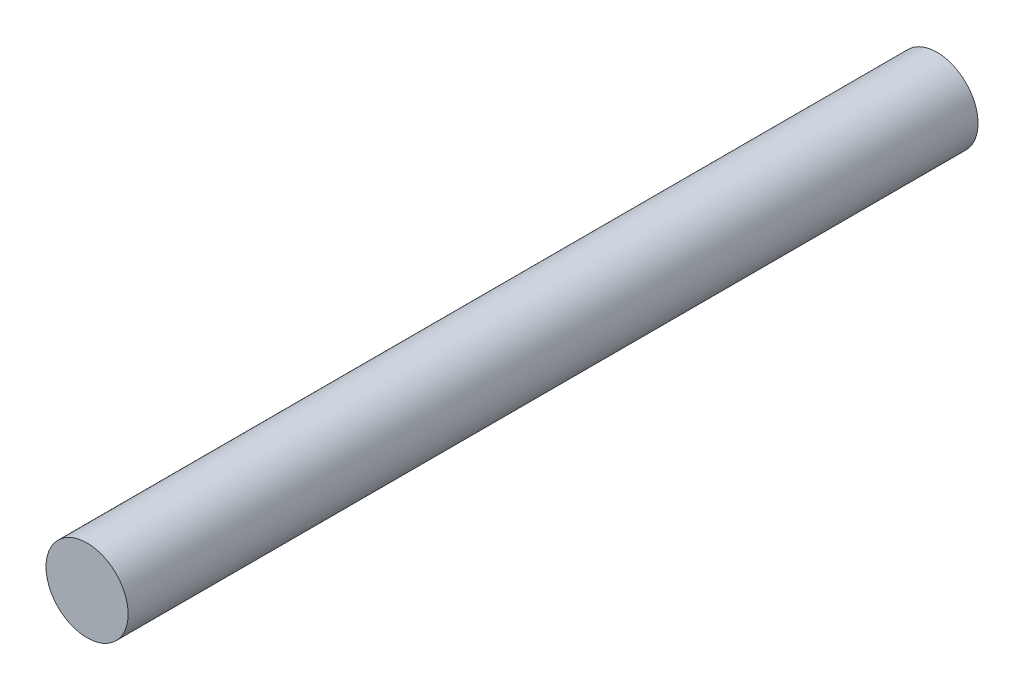
ISO-10303-21;
HEADER;
FILE_DESCRIPTION(('STEP AP214'),'2;1');
FILE_NAME('part.step','',(''),(''),'','','');
FILE_SCHEMA(('AUTOMOTIVE_DESIGN { 1 0 10303 214 1 1 1 1 }'));
ENDSEC;
DATA;
#1=APPLICATION_CONTEXT('core data for automotive mechanical design processes');
#2=APPLICATION_PROTOCOL_DEFINITION('international standard','automotive_design',2000,#1);
#3=PRODUCT_CONTEXT('',#1,'mechanical');
#4=PRODUCT('Part','Part','',(#3));
#5=PRODUCT_RELATED_PRODUCT_CATEGORY('part','',(#4));
#6=PRODUCT_DEFINITION_FORMATION('','',#4);
#7=PRODUCT_DEFINITION_CONTEXT('part definition',#1,'design');
#8=PRODUCT_DEFINITION('design','',#6,#7);
#9=PRODUCT_DEFINITION_SHAPE('','',#8);
#10=(LENGTH_UNIT() NAMED_UNIT(*) SI_UNIT(.MILLI.,.METRE.));
#11=(NAMED_UNIT(*) PLANE_ANGLE_UNIT() SI_UNIT($,.RADIAN.));
#12=(NAMED_UNIT(*) SI_UNIT($,.STERADIAN.) SOLID_ANGLE_UNIT());
#13=UNCERTAINTY_MEASURE_WITH_UNIT(LENGTH_MEASURE(1.E-05),#10,'distance_accuracy_value','');
#14=(GEOMETRIC_REPRESENTATION_CONTEXT(3) GLOBAL_UNCERTAINTY_ASSIGNED_CONTEXT((#13)) GLOBAL_UNIT_ASSIGNED_CONTEXT((#10,
#11,#12)) REPRESENTATION_CONTEXT('',''));
#15=CARTESIAN_POINT('',(0.,0.,0.));
#16=DIRECTION('',(0.,0.,1.));
#17=DIRECTION('',(1.,0.,0.));
#18=AXIS2_PLACEMENT_3D('',#15,#16,#17);
#19=CARTESIAN_POINT('',(0.,0.,98.552));
#20=DIRECTION('',(0.,0.,-1.));
#21=DIRECTION('',(-1.,0.,0.));
#22=AXIS2_PLACEMENT_3D('',#19,#20,#21);
#23=CYLINDRICAL_SURFACE('',#22,4.7625);
#24=CARTESIAN_POINT('',(0.,0.,98.552));
#25=DIRECTION('',(0.,0.,1.));
#26=DIRECTION('',(1.,0.,0.));
#27=AXIS2_PLACEMENT_3D('',#24,#25,#26);
#28=CIRCLE('',#27,4.7625);
#29=CARTESIAN_POINT('',(-4.7625,0.,98.552));
#30=VERTEX_POINT('',#29);
#31=EDGE_CURVE('E10',#30,#30,#28,.T.);
#32=CARTESIAN_POINT('',(0.,0.,0.));
#33=DIRECTION('',(0.,0.,1.));
#34=DIRECTION('',(1.,0.,0.));
#35=AXIS2_PLACEMENT_3D('',#32,#33,#34);
#36=CIRCLE('',#35,4.7625);
#37=CARTESIAN_POINT('',(-4.7625,0.,0.));
#38=VERTEX_POINT('',#37);
#39=EDGE_CURVE('E33',#38,#38,#36,.T.);
#40=CARTESIAN_POINT('',(-4.7625,0.,98.552));
#41=CARTESIAN_POINT('',(-4.7625,0.,97.5254166666667));
#42=CARTESIAN_POINT('',(-4.7625,0.,96.4988333333333));
#43=CARTESIAN_POINT('',(-4.7625,0.,94.4456666666667));
#44=CARTESIAN_POINT('',(-4.7625,0.,93.4190833333333));
#45=CARTESIAN_POINT('',(-4.7625,0.,91.3659166666667));
#46=CARTESIAN_POINT('',(-4.7625,0.,90.3393333333333));
#47=CARTESIAN_POINT('',(-4.7625,0.,88.2861666666667));
#48=CARTESIAN_POINT('',(-4.7625,0.,87.2595833333333));
#49=CARTESIAN_POINT('',(-4.7625,0.,85.2064166666667));
#50=CARTESIAN_POINT('',(-4.7625,0.,84.1798333333333));
#51=CARTESIAN_POINT('',(-4.7625,0.,82.1266666666667));
#52=CARTESIAN_POINT('',(-4.7625,0.,81.1000833333333));
#53=CARTESIAN_POINT('',(-4.7625,0.,79.0469166666667));
#54=CARTESIAN_POINT('',(-4.7625,0.,78.0203333333333));
#55=CARTESIAN_POINT('',(-4.7625,0.,75.9671666666667));
#56=CARTESIAN_POINT('',(-4.7625,0.,74.9405833333333));
#57=CARTESIAN_POINT('',(-4.7625,0.,72.8874166666667));
#58=CARTESIAN_POINT('',(-4.7625,0.,71.8608333333333));
#59=CARTESIAN_POINT('',(-4.7625,0.,69.8076666666667));
#60=CARTESIAN_POINT('',(-4.7625,0.,68.7810833333333));
#61=CARTESIAN_POINT('',(-4.7625,0.,66.7279166666667));
#62=CARTESIAN_POINT('',(-4.7625,0.,65.7013333333333));
#63=CARTESIAN_POINT('',(-4.7625,0.,63.6481666666667));
#64=CARTESIAN_POINT('',(-4.7625,0.,62.6215833333333));
#65=CARTESIAN_POINT('',(-4.7625,0.,60.5684166666667));
#66=CARTESIAN_POINT('',(-4.7625,0.,59.5418333333333));
#67=CARTESIAN_POINT('',(-4.7625,0.,57.4886666666667));
#68=CARTESIAN_POINT('',(-4.7625,0.,56.4620833333333));
#69=CARTESIAN_POINT('',(-4.7625,0.,54.4089166666667));
#70=CARTESIAN_POINT('',(-4.7625,0.,53.3823333333333));
#71=CARTESIAN_POINT('',(-4.7625,0.,51.3291666666667));
#72=CARTESIAN_POINT('',(-4.7625,0.,50.3025833333333));
#73=CARTESIAN_POINT('',(-4.7625,0.,48.2494166666667));
#74=CARTESIAN_POINT('',(-4.7625,0.,47.2228333333333));
#75=CARTESIAN_POINT('',(-4.7625,0.,45.1696666666667));
#76=CARTESIAN_POINT('',(-4.7625,0.,44.1430833333333));
#77=CARTESIAN_POINT('',(-4.7625,0.,42.0899166666667));
#78=CARTESIAN_POINT('',(-4.7625,0.,41.0633333333333));
#79=CARTESIAN_POINT('',(-4.7625,0.,39.0101666666666));
#80=CARTESIAN_POINT('',(-4.7625,0.,37.9835833333333));
#81=CARTESIAN_POINT('',(-4.7625,0.,35.9304166666667));
#82=CARTESIAN_POINT('',(-4.7625,0.,34.9038333333333));
#83=CARTESIAN_POINT('',(-4.7625,0.,32.8506666666667));
#84=CARTESIAN_POINT('',(-4.7625,0.,31.8240833333333));
#85=CARTESIAN_POINT('',(-4.7625,0.,29.7709166666667));
#86=CARTESIAN_POINT('',(-4.7625,0.,28.7443333333333));
#87=CARTESIAN_POINT('',(-4.7625,0.,26.6911666666667));
#88=CARTESIAN_POINT('',(-4.7625,0.,25.6645833333333));
#89=CARTESIAN_POINT('',(-4.7625,0.,23.6114166666667));
#90=CARTESIAN_POINT('',(-4.7625,0.,22.5848333333333));
#91=CARTESIAN_POINT('',(-4.7625,0.,20.5316666666667));
#92=CARTESIAN_POINT('',(-4.7625,0.,19.5050833333333));
#93=CARTESIAN_POINT('',(-4.7625,0.,17.4519166666667));
#94=CARTESIAN_POINT('',(-4.7625,0.,16.4253333333333));
#95=CARTESIAN_POINT('',(-4.7625,0.,14.3721666666667));
#96=CARTESIAN_POINT('',(-4.7625,0.,13.3455833333333));
#97=CARTESIAN_POINT('',(-4.7625,0.,11.2924166666667));
#98=CARTESIAN_POINT('',(-4.7625,0.,10.2658333333333));
#99=CARTESIAN_POINT('',(-4.7625,0.,8.21266666666665));
#100=CARTESIAN_POINT('',(-4.7625,0.,7.18608333333332));
#101=CARTESIAN_POINT('',(-4.7625,0.,5.13291666666665));
#102=CARTESIAN_POINT('',(-4.7625,0.,4.10633333333332));
#103=CARTESIAN_POINT('',(-4.7625,0.,2.05316666666666));
#104=CARTESIAN_POINT('',(-4.7625,0.,1.02658333333332));
#105=CARTESIAN_POINT('',(-4.7625,0.,0.));
#106=B_SPLINE_CURVE_WITH_KNOTS('',3,(#40,#41,#42,#43,#44,#45,#46,#47,#48,#49,#50,#51,#52,#53,
#54,#55,#56,#57,#58,#59,#60,#61,#62,#63,#64,#65,#66,#67,#68,#69,#70,#71,#72,#73,#74,#75,#76,#77,
#78,#79,#80,#81,#82,#83,#84,#85,#86,#87,#88,#89,#90,#91,#92,#93,#94,#95,#96,#97,#98,#99,#100,
#101,#102,#103,#104,#105),.UNSPECIFIED.,.F.,.F.,(4,2,2,2,2,2,2,2,2,2,2,2,2,2,2,2,2,2,2,2,2,2,2,
2,2,2,2,2,2,2,2,2,4),(0.,3.07975000000001,6.15950000000001,9.23925,12.319,15.39875,18.4785,
21.55825,24.638,27.71775,30.7975,33.87725,36.957,40.03675,43.1165,46.19625,49.276,52.35575,
55.4355,58.51525,61.595,64.67475,67.7545,70.83425,73.914,76.99375,80.0735,83.15325,86.233,
89.31275,92.3925,95.47225,98.552),.UNSPECIFIED.);
#107=EDGE_CURVE('BSEAM30',#30,#38,#106,.T.);
#108=ORIENTED_EDGE('',*,*,#31,.F.);
#109=ORIENTED_EDGE('',*,*,#39,.T.);
#110=ORIENTED_EDGE('',*,*,#107,.T.);
#111=ORIENTED_EDGE('',*,*,#107,.F.);
#112=EDGE_LOOP('',(#108,#110,#109,#111));
#113=FACE_BOUND('',#112,.T.);
#114=ADVANCED_FACE('F30',(#113),#23,.T.);
#115=CARTESIAN_POINT('',(0.,0.,98.552));
#116=DIRECTION('',(0.,0.,1.));
#117=DIRECTION('',(1.,0.,0.));
#118=AXIS2_PLACEMENT_3D('',#115,#116,#117);
#119=PLANE('',#118);
#120=ORIENTED_EDGE('',*,*,#31,.T.);
#121=EDGE_LOOP('',(#120));
#122=FACE_BOUND('',#121,.T.);
#123=ADVANCED_FACE('F45',(#122),#119,.T.);
#124=CARTESIAN_POINT('',(0.,0.,0.));
#125=DIRECTION('',(0.,0.,1.));
#126=DIRECTION('',(1.,0.,0.));
#127=AXIS2_PLACEMENT_3D('',#124,#125,#126);
#128=PLANE('',#127);
#129=ORIENTED_EDGE('',*,*,#39,.F.);
#130=EDGE_LOOP('',(#129));
#131=FACE_BOUND('',#130,.T.);
#132=ADVANCED_FACE('F43',(#131),#128,.F.);
#133=CLOSED_SHELL('',(#114,#123,#132));
#134=MANIFOLD_SOLID_BREP('B2',#133);
#135=ADVANCED_BREP_SHAPE_REPRESENTATION('',(#18,#134),#14);
#136=SHAPE_DEFINITION_REPRESENTATION(#9,#135);
ENDSEC;
END-ISO-10303-21;
